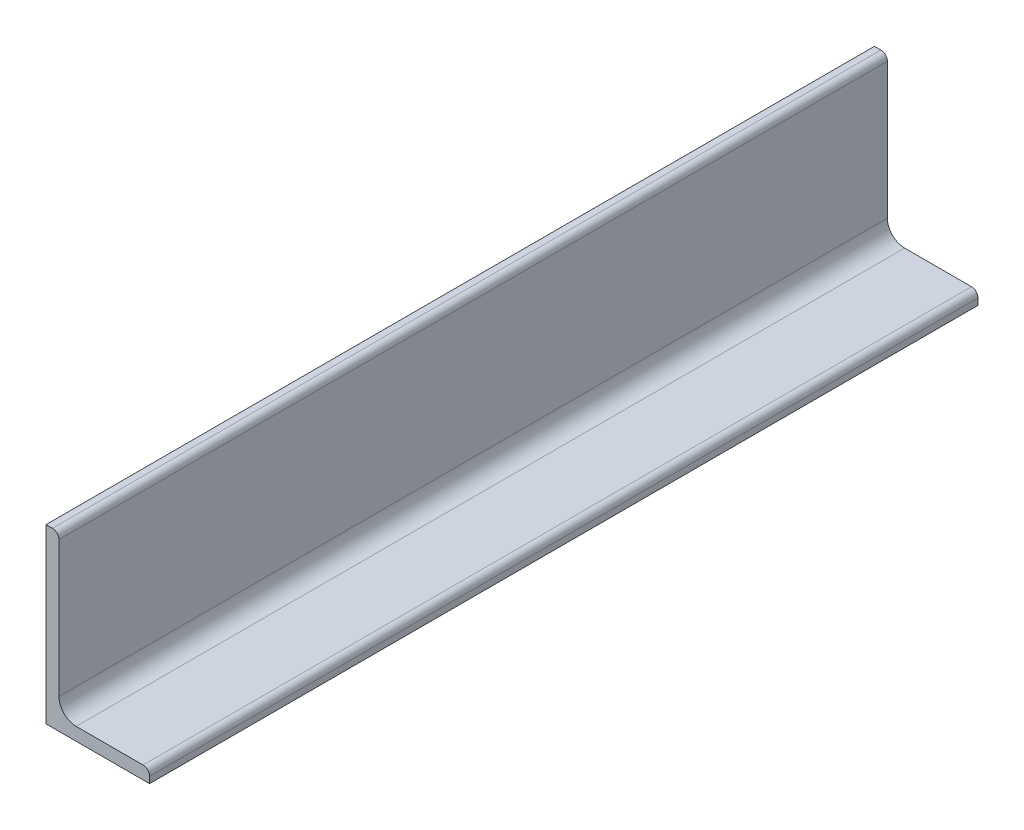
ISO-10303-21;
HEADER;
FILE_DESCRIPTION(('STEP AP214'),'2;1');
FILE_NAME('part.step','',(''),(''),'','','');
FILE_SCHEMA(('AUTOMOTIVE_DESIGN { 1 0 10303 214 1 1 1 1 }'));
ENDSEC;
DATA;
#1=APPLICATION_CONTEXT('core data for automotive mechanical design processes');
#2=APPLICATION_PROTOCOL_DEFINITION('international standard','automotive_design',2000,#1);
#3=PRODUCT_CONTEXT('',#1,'mechanical');
#4=PRODUCT('Part','Part','',(#3));
#5=PRODUCT_RELATED_PRODUCT_CATEGORY('part','',(#4));
#6=PRODUCT_DEFINITION_FORMATION('','',#4);
#7=PRODUCT_DEFINITION_CONTEXT('part definition',#1,'design');
#8=PRODUCT_DEFINITION('design','',#6,#7);
#9=PRODUCT_DEFINITION_SHAPE('','',#8);
#10=(LENGTH_UNIT() NAMED_UNIT(*) SI_UNIT(.MILLI.,.METRE.));
#11=(NAMED_UNIT(*) PLANE_ANGLE_UNIT() SI_UNIT($,.RADIAN.));
#12=(NAMED_UNIT(*) SI_UNIT($,.STERADIAN.) SOLID_ANGLE_UNIT());
#13=UNCERTAINTY_MEASURE_WITH_UNIT(LENGTH_MEASURE(1.E-05),#10,'distance_accuracy_value','');
#14=(GEOMETRIC_REPRESENTATION_CONTEXT(3) GLOBAL_UNCERTAINTY_ASSIGNED_CONTEXT((#13)) GLOBAL_UNIT_ASSIGNED_CONTEXT((#10,
#11,#12)) REPRESENTATION_CONTEXT('',''));
#15=CARTESIAN_POINT('',(0.,0.,0.));
#16=DIRECTION('',(0.,0.,1.));
#17=DIRECTION('',(1.,0.,0.));
#18=AXIS2_PLACEMENT_3D('',#15,#16,#17);
#19=CARTESIAN_POINT('',(0.523658184719261,63.8534276781816,304.8));
#20=DIRECTION('',(1.,0.,0.));
#21=DIRECTION('',(0.,0.,-1.));
#22=AXIS2_PLACEMENT_3D('',#19,#20,#21);
#23=PLANE('',#22);
#24=DIRECTION('',(0.,-1.,0.));
#25=VECTOR('',#24,1.);
#26=CARTESIAN_POINT('',(0.523658184719261,63.8534276781816,0.));
#27=LINE('',#26,#25);
#28=CARTESIAN_POINT('',(0.523658184719261,63.8534276781816,0.));
#29=VERTEX_POINT('',#28);
#30=CARTESIAN_POINT('',(0.523658184719261,0.353427678181561,0.));
#31=VERTEX_POINT('',#30);
#32=EDGE_CURVE('E135',#29,#31,#27,.T.);
#33=ORIENTED_EDGE('',*,*,#32,.T.);
#34=DIRECTION('',(0.,0.,-1.));
#35=VECTOR('',#34,1.);
#36=CARTESIAN_POINT('',(0.523658184719261,0.353427678181561,304.8));
#37=LINE('',#36,#35);
#38=CARTESIAN_POINT('',(0.523658184719261,0.353427678181561,304.8));
#39=VERTEX_POINT('',#38);
#40=EDGE_CURVE('E11',#39,#31,#37,.T.);
#41=ORIENTED_EDGE('',*,*,#40,.F.);
#42=DIRECTION('',(0.,-1.,0.));
#43=VECTOR('',#42,1.);
#44=CARTESIAN_POINT('',(0.523658184719261,63.8534276781816,304.8));
#45=LINE('',#44,#43);
#46=CARTESIAN_POINT('',(0.523658184719261,63.8534276781816,304.8));
#47=VERTEX_POINT('',#46);
#48=EDGE_CURVE('E151',#47,#39,#45,.T.);
#49=ORIENTED_EDGE('',*,*,#48,.F.);
#50=DIRECTION('',(0.,0.,-1.));
#51=VECTOR('',#50,1.);
#52=CARTESIAN_POINT('',(0.523658184719261,63.8534276781816,304.8));
#53=LINE('',#52,#51);
#54=EDGE_CURVE('E131',#47,#29,#53,.T.);
#55=ORIENTED_EDGE('',*,*,#54,.T.);
#56=EDGE_LOOP('',(#33,#41,#49,#55));
#57=FACE_BOUND('',#56,.T.);
#58=ADVANCED_FACE('F33',(#57),#23,.F.);
#59=CARTESIAN_POINT('',(0.523658184719261,0.353427678181561,304.8));
#60=DIRECTION('',(0.,1.,0.));
#61=DIRECTION('',(0.,0.,1.));
#62=AXIS2_PLACEMENT_3D('',#59,#60,#61);
#63=PLANE('',#62);
#64=DIRECTION('',(1.,0.,0.));
#65=VECTOR('',#64,1.);
#66=CARTESIAN_POINT('',(0.523658184719261,0.353427678181561,0.));
#67=LINE('',#66,#65);
#68=CARTESIAN_POINT('',(38.6236581847193,0.353427678181561,0.));
#69=VERTEX_POINT('',#68);
#70=EDGE_CURVE('E138',#31,#69,#67,.T.);
#71=ORIENTED_EDGE('',*,*,#70,.T.);
#72=DIRECTION('',(0.,0.,-1.));
#73=VECTOR('',#72,1.);
#74=CARTESIAN_POINT('',(38.6236581847193,0.353427678181561,304.8));
#75=LINE('',#74,#73);
#76=CARTESIAN_POINT('',(38.6236581847193,0.353427678181561,304.8));
#77=VERTEX_POINT('',#76);
#78=EDGE_CURVE('E41',#77,#69,#75,.T.);
#79=ORIENTED_EDGE('',*,*,#78,.F.);
#80=DIRECTION('',(1.,0.,0.));
#81=VECTOR('',#80,1.);
#82=CARTESIAN_POINT('',(0.523658184719261,0.353427678181561,304.8));
#83=LINE('',#82,#81);
#84=EDGE_CURVE('E95',#39,#77,#83,.T.);
#85=ORIENTED_EDGE('',*,*,#84,.F.);
#86=ORIENTED_EDGE('',*,*,#40,.T.);
#87=EDGE_LOOP('',(#71,#79,#85,#86));
#88=FACE_BOUND('',#87,.T.);
#89=ADVANCED_FACE('F194',(#88),#63,.F.);
#90=CARTESIAN_POINT('',(38.6236581847193,0.353427678181561,304.8));
#91=DIRECTION('',(-1.,0.,0.));
#92=DIRECTION('',(0.,0.,1.));
#93=AXIS2_PLACEMENT_3D('',#90,#91,#92);
#94=PLANE('',#93);
#95=DIRECTION('',(0.,1.,0.));
#96=VECTOR('',#95,1.);
#97=CARTESIAN_POINT('',(38.6236581847193,0.353427678181561,0.));
#98=LINE('',#97,#96);
#99=CARTESIAN_POINT('',(38.6236581847193,2.73467767818156,0.));
#100=VERTEX_POINT('',#99);
#101=EDGE_CURVE('E140',#69,#100,#98,.T.);
#102=ORIENTED_EDGE('',*,*,#101,.T.);
#103=DIRECTION('',(0.,0.,-1.));
#104=VECTOR('',#103,1.);
#105=CARTESIAN_POINT('',(38.6236581847193,2.73467767818156,304.8));
#106=LINE('',#105,#104);
#107=CARTESIAN_POINT('',(38.6236581847193,2.73467767818156,304.8));
#108=VERTEX_POINT('',#107);
#109=EDGE_CURVE('E161',#108,#100,#106,.T.);
#110=ORIENTED_EDGE('',*,*,#109,.F.);
#111=DIRECTION('',(0.,1.,0.));
#112=VECTOR('',#111,1.);
#113=CARTESIAN_POINT('',(38.6236581847193,0.353427678181561,304.8));
#114=LINE('',#113,#112);
#115=EDGE_CURVE('E169',#77,#108,#114,.T.);
#116=ORIENTED_EDGE('',*,*,#115,.F.);
#117=ORIENTED_EDGE('',*,*,#78,.T.);
#118=EDGE_LOOP('',(#102,#110,#116,#117));
#119=FACE_BOUND('',#118,.T.);
#120=ADVANCED_FACE('F167',(#119),#94,.F.);
#121=CARTESIAN_POINT('',(36.2424081847193,2.73467767818156,304.8));
#122=DIRECTION('',(0.,0.,-1.));
#123=DIRECTION('',(-1.,0.,0.));
#124=AXIS2_PLACEMENT_3D('',#121,#122,#123);
#125=CYLINDRICAL_SURFACE('',#124,2.38125);
#126=CARTESIAN_POINT('',(36.2424081847193,2.73467767818156,0.));
#127=DIRECTION('',(0.,0.,1.));
#128=DIRECTION('',(1.,0.,0.));
#129=AXIS2_PLACEMENT_3D('',#126,#127,#128);
#130=CIRCLE('',#129,2.38125);
#131=CARTESIAN_POINT('',(36.2424081847193,5.11592767818156,0.));
#132=VERTEX_POINT('',#131);
#133=EDGE_CURVE('E142',#100,#132,#130,.T.);
#134=ORIENTED_EDGE('',*,*,#133,.T.);
#135=DIRECTION('',(0.,0.,-1.));
#136=VECTOR('',#135,1.);
#137=CARTESIAN_POINT('',(36.2424081847193,5.11592767818156,304.8));
#138=LINE('',#137,#136);
#139=CARTESIAN_POINT('',(36.2424081847193,5.11592767818156,304.8));
#140=VERTEX_POINT('',#139);
#141=EDGE_CURVE('E158',#140,#132,#138,.T.);
#142=ORIENTED_EDGE('',*,*,#141,.F.);
#143=CARTESIAN_POINT('',(36.2424081847193,2.73467767818156,304.8));
#144=DIRECTION('',(0.,0.,1.));
#145=DIRECTION('',(1.,0.,0.));
#146=AXIS2_PLACEMENT_3D('',#143,#144,#145);
#147=CIRCLE('',#146,2.38125);
#148=EDGE_CURVE('E185',#108,#140,#147,.T.);
#149=ORIENTED_EDGE('',*,*,#148,.F.);
#150=ORIENTED_EDGE('',*,*,#109,.T.);
#151=EDGE_LOOP('',(#134,#142,#149,#150));
#152=FACE_BOUND('',#151,.T.);
#153=ADVANCED_FACE('F178',(#152),#125,.T.);
#154=CARTESIAN_POINT('',(36.2424081847193,5.11592767818156,304.8));
#155=DIRECTION('',(0.,-1.,0.));
#156=DIRECTION('',(0.,0.,-1.));
#157=AXIS2_PLACEMENT_3D('',#154,#155,#156);
#158=PLANE('',#157);
#159=DIRECTION('',(-1.,0.,0.));
#160=VECTOR('',#159,1.);
#161=CARTESIAN_POINT('',(36.2424081847193,5.11592767818156,0.));
#162=LINE('',#161,#160);
#163=CARTESIAN_POINT('',(11.6361581847193,5.11592767818156,0.));
#164=VERTEX_POINT('',#163);
#165=EDGE_CURVE('E144',#132,#164,#162,.T.);
#166=ORIENTED_EDGE('',*,*,#165,.T.);
#167=DIRECTION('',(0.,0.,-1.));
#168=VECTOR('',#167,1.);
#169=CARTESIAN_POINT('',(11.6361581847193,5.11592767818156,304.8));
#170=LINE('',#169,#168);
#171=CARTESIAN_POINT('',(11.6361581847193,5.11592767818156,304.8));
#172=VERTEX_POINT('',#171);
#173=EDGE_CURVE('E155',#172,#164,#170,.T.);
#174=ORIENTED_EDGE('',*,*,#173,.F.);
#175=DIRECTION('',(-1.,0.,0.));
#176=VECTOR('',#175,1.);
#177=CARTESIAN_POINT('',(36.2424081847193,5.11592767818156,304.8));
#178=LINE('',#177,#176);
#179=EDGE_CURVE('E184',#140,#172,#178,.T.);
#180=ORIENTED_EDGE('',*,*,#179,.F.);
#181=ORIENTED_EDGE('',*,*,#141,.T.);
#182=EDGE_LOOP('',(#166,#174,#180,#181));
#183=FACE_BOUND('',#182,.T.);
#184=ADVANCED_FACE('F182',(#183),#158,.F.);
#185=CARTESIAN_POINT('',(11.6361581847193,11.4659276781816,304.8));
#186=DIRECTION('',(0.,0.,-1.));
#187=DIRECTION('',(-1.,0.,0.));
#188=AXIS2_PLACEMENT_3D('',#185,#186,#187);
#189=CYLINDRICAL_SURFACE('',#188,6.34999999999999);
#190=CARTESIAN_POINT('',(11.6361581847193,11.4659276781816,0.));
#191=DIRECTION('',(0.,0.,-1.));
#192=DIRECTION('',(1.,0.,0.));
#193=AXIS2_PLACEMENT_3D('',#190,#191,#192);
#194=CIRCLE('',#193,6.34999999999999);
#195=CARTESIAN_POINT('',(5.28615818471926,11.4659276781816,0.));
#196=VERTEX_POINT('',#195);
#197=EDGE_CURVE('E146',#164,#196,#194,.T.);
#198=ORIENTED_EDGE('',*,*,#197,.T.);
#199=DIRECTION('',(0.,0.,-1.));
#200=VECTOR('',#199,1.);
#201=CARTESIAN_POINT('',(5.28615818471926,11.4659276781816,304.8));
#202=LINE('',#201,#200);
#203=CARTESIAN_POINT('',(5.28615818471926,11.4659276781816,304.8));
#204=VERTEX_POINT('',#203);
#205=EDGE_CURVE('E126',#204,#196,#202,.T.);
#206=ORIENTED_EDGE('',*,*,#205,.F.);
#207=CARTESIAN_POINT('',(11.6361581847193,11.4659276781816,304.8));
#208=DIRECTION('',(0.,0.,-1.));
#209=DIRECTION('',(1.,0.,0.));
#210=AXIS2_PLACEMENT_3D('',#207,#208,#209);
#211=CIRCLE('',#210,6.34999999999999);
#212=EDGE_CURVE('E117',#172,#204,#211,.T.);
#213=ORIENTED_EDGE('',*,*,#212,.F.);
#214=ORIENTED_EDGE('',*,*,#173,.T.);
#215=EDGE_LOOP('',(#198,#206,#213,#214));
#216=FACE_BOUND('',#215,.T.);
#217=ADVANCED_FACE('F206',(#216),#189,.F.);
#218=CARTESIAN_POINT('',(5.28615818471926,11.4659276781816,304.8));
#219=DIRECTION('',(-1.,0.,0.));
#220=DIRECTION('',(0.,0.,1.));
#221=AXIS2_PLACEMENT_3D('',#218,#219,#220);
#222=PLANE('',#221);
#223=DIRECTION('',(0.,1.,0.));
#224=VECTOR('',#223,1.);
#225=CARTESIAN_POINT('',(5.28615818471926,11.4659276781816,0.));
#226=LINE('',#225,#224);
#227=CARTESIAN_POINT('',(5.28615818471926,61.4721776781816,0.));
#228=VERTEX_POINT('',#227);
#229=EDGE_CURVE('E125',#196,#228,#226,.T.);
#230=ORIENTED_EDGE('',*,*,#229,.T.);
#231=DIRECTION('',(0.,0.,-1.));
#232=VECTOR('',#231,1.);
#233=CARTESIAN_POINT('',(5.28615818471926,61.4721776781816,304.8));
#234=LINE('',#233,#232);
#235=CARTESIAN_POINT('',(5.28615818471926,61.4721776781816,304.8));
#236=VERTEX_POINT('',#235);
#237=EDGE_CURVE('E122',#236,#228,#234,.T.);
#238=ORIENTED_EDGE('',*,*,#237,.F.);
#239=DIRECTION('',(0.,1.,0.));
#240=VECTOR('',#239,1.);
#241=CARTESIAN_POINT('',(5.28615818471926,11.4659276781816,304.8));
#242=LINE('',#241,#240);
#243=EDGE_CURVE('E111',#204,#236,#242,.T.);
#244=ORIENTED_EDGE('',*,*,#243,.F.);
#245=ORIENTED_EDGE('',*,*,#205,.T.);
#246=EDGE_LOOP('',(#230,#238,#244,#245));
#247=FACE_BOUND('',#246,.T.);
#248=ADVANCED_FACE('F123',(#247),#222,.F.);
#249=CARTESIAN_POINT('',(2.90490818471926,61.4721776781816,304.8));
#250=DIRECTION('',(0.,0.,-1.));
#251=DIRECTION('',(-1.,0.,0.));
#252=AXIS2_PLACEMENT_3D('',#249,#250,#251);
#253=CYLINDRICAL_SURFACE('',#252,2.38125);
#254=CARTESIAN_POINT('',(2.90490818471926,61.4721776781816,0.));
#255=DIRECTION('',(0.,0.,1.));
#256=DIRECTION('',(1.,0.,0.));
#257=AXIS2_PLACEMENT_3D('',#254,#255,#256);
#258=CIRCLE('',#257,2.38125);
#259=CARTESIAN_POINT('',(2.90490818471926,63.8534276781816,0.));
#260=VERTEX_POINT('',#259);
#261=EDGE_CURVE('E81',#228,#260,#258,.T.);
#262=ORIENTED_EDGE('',*,*,#261,.T.);
#263=DIRECTION('',(0.,0.,-1.));
#264=VECTOR('',#263,1.);
#265=CARTESIAN_POINT('',(2.90490818471926,63.8534276781816,304.8));
#266=LINE('',#265,#264);
#267=CARTESIAN_POINT('',(2.90490818471926,63.8534276781816,304.8));
#268=VERTEX_POINT('',#267);
#269=EDGE_CURVE('E127',#268,#260,#266,.T.);
#270=ORIENTED_EDGE('',*,*,#269,.F.);
#271=CARTESIAN_POINT('',(2.90490818471926,61.4721776781816,304.8));
#272=DIRECTION('',(0.,0.,1.));
#273=DIRECTION('',(1.,0.,0.));
#274=AXIS2_PLACEMENT_3D('',#271,#272,#273);
#275=CIRCLE('',#274,2.38125);
#276=EDGE_CURVE('E115',#236,#268,#275,.T.);
#277=ORIENTED_EDGE('',*,*,#276,.F.);
#278=ORIENTED_EDGE('',*,*,#237,.T.);
#279=EDGE_LOOP('',(#262,#270,#277,#278));
#280=FACE_BOUND('',#279,.T.);
#281=ADVANCED_FACE('F129',(#280),#253,.T.);
#282=CARTESIAN_POINT('',(2.90490818471926,63.8534276781816,304.8));
#283=DIRECTION('',(0.,-1.,0.));
#284=DIRECTION('',(0.,0.,-1.));
#285=AXIS2_PLACEMENT_3D('',#282,#283,#284);
#286=PLANE('',#285);
#287=DIRECTION('',(-1.,0.,0.));
#288=VECTOR('',#287,1.);
#289=CARTESIAN_POINT('',(2.90490818471926,63.8534276781816,0.));
#290=LINE('',#289,#288);
#291=EDGE_CURVE('E87',#260,#29,#290,.T.);
#292=ORIENTED_EDGE('',*,*,#291,.T.);
#293=ORIENTED_EDGE('',*,*,#54,.F.);
#294=DIRECTION('',(-1.,0.,0.));
#295=VECTOR('',#294,1.);
#296=CARTESIAN_POINT('',(2.90490818471926,63.8534276781816,304.8));
#297=LINE('',#296,#295);
#298=EDGE_CURVE('E49',#268,#47,#297,.T.);
#299=ORIENTED_EDGE('',*,*,#298,.F.);
#300=ORIENTED_EDGE('',*,*,#269,.T.);
#301=EDGE_LOOP('',(#292,#293,#299,#300));
#302=FACE_BOUND('',#301,.T.);
#303=ADVANCED_FACE('F214',(#302),#286,.F.);
#304=CARTESIAN_POINT('',(36.2424081847193,2.73467767818156,304.8));
#305=DIRECTION('',(0.,0.,1.));
#306=DIRECTION('',(1.,0.,0.));
#307=AXIS2_PLACEMENT_3D('',#304,#305,#306);
#308=PLANE('',#307);
#309=ORIENTED_EDGE('',*,*,#48,.T.);
#310=ORIENTED_EDGE('',*,*,#84,.T.);
#311=ORIENTED_EDGE('',*,*,#115,.T.);
#312=ORIENTED_EDGE('',*,*,#148,.T.);
#313=ORIENTED_EDGE('',*,*,#179,.T.);
#314=ORIENTED_EDGE('',*,*,#212,.T.);
#315=ORIENTED_EDGE('',*,*,#243,.T.);
#316=ORIENTED_EDGE('',*,*,#276,.T.);
#317=ORIENTED_EDGE('',*,*,#298,.T.);
#318=EDGE_LOOP('',(#309,#310,#311,#312,#313,#314,#315,#316,#317));
#319=FACE_BOUND('',#318,.T.);
#320=ADVANCED_FACE('F113',(#319),#308,.T.);
#321=CARTESIAN_POINT('',(36.2424081847193,2.73467767818156,0.));
#322=DIRECTION('',(0.,0.,1.));
#323=DIRECTION('',(1.,0.,0.));
#324=AXIS2_PLACEMENT_3D('',#321,#322,#323);
#325=PLANE('',#324);
#326=ORIENTED_EDGE('',*,*,#32,.F.);
#327=ORIENTED_EDGE('',*,*,#291,.F.);
#328=ORIENTED_EDGE('',*,*,#261,.F.);
#329=ORIENTED_EDGE('',*,*,#229,.F.);
#330=ORIENTED_EDGE('',*,*,#197,.F.);
#331=ORIENTED_EDGE('',*,*,#165,.F.);
#332=ORIENTED_EDGE('',*,*,#133,.F.);
#333=ORIENTED_EDGE('',*,*,#101,.F.);
#334=ORIENTED_EDGE('',*,*,#70,.F.);
#335=EDGE_LOOP('',(#326,#327,#328,#329,#330,#331,#332,#333,#334));
#336=FACE_BOUND('',#335,.T.);
#337=ADVANCED_FACE('F173',(#336),#325,.F.);
#338=CLOSED_SHELL('',(#58,#89,#120,#153,#184,#217,#248,#281,#303,#320,#337));
#339=MANIFOLD_SOLID_BREP('B2',#338);
#340=ADVANCED_BREP_SHAPE_REPRESENTATION('',(#18,#339),#14);
#341=SHAPE_DEFINITION_REPRESENTATION(#9,#340);
ENDSEC;
END-ISO-10303-21;
